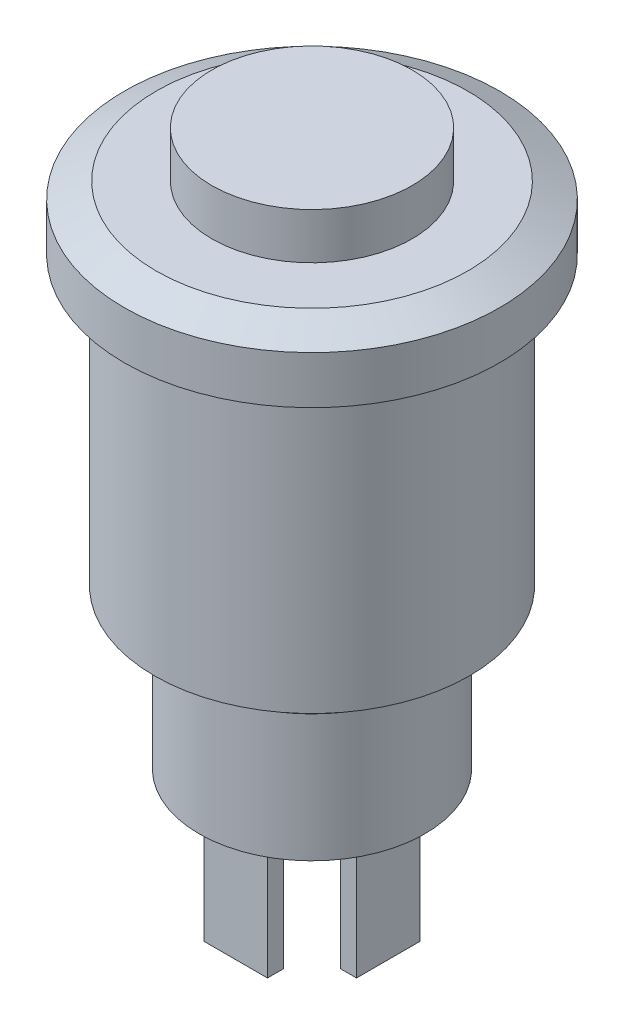
ISO-10303-21;
HEADER;
FILE_DESCRIPTION(('STEP AP214'),'2;1');
FILE_NAME('part.step','',(''),(''),'','','');
FILE_SCHEMA(('AUTOMOTIVE_DESIGN { 1 0 10303 214 1 1 1 1 }'));
ENDSEC;
DATA;
#1=APPLICATION_CONTEXT('core data for automotive mechanical design processes');
#2=APPLICATION_PROTOCOL_DEFINITION('international standard','automotive_design',2000,#1);
#3=PRODUCT_CONTEXT('',#1,'mechanical');
#4=PRODUCT('Part','Part','',(#3));
#5=PRODUCT_RELATED_PRODUCT_CATEGORY('part','',(#4));
#6=PRODUCT_DEFINITION_FORMATION('','',#4);
#7=PRODUCT_DEFINITION_CONTEXT('part definition',#1,'design');
#8=PRODUCT_DEFINITION('design','',#6,#7);
#9=PRODUCT_DEFINITION_SHAPE('','',#8);
#10=(LENGTH_UNIT() NAMED_UNIT(*) SI_UNIT(.MILLI.,.METRE.));
#11=(NAMED_UNIT(*) PLANE_ANGLE_UNIT() SI_UNIT($,.RADIAN.));
#12=(NAMED_UNIT(*) SI_UNIT($,.STERADIAN.) SOLID_ANGLE_UNIT());
#13=UNCERTAINTY_MEASURE_WITH_UNIT(LENGTH_MEASURE(1.E-05),#10,'distance_accuracy_value','');
#14=(GEOMETRIC_REPRESENTATION_CONTEXT(3) GLOBAL_UNCERTAINTY_ASSIGNED_CONTEXT((#13)) GLOBAL_UNIT_ASSIGNED_CONTEXT((#10,
#11,#12)) REPRESENTATION_CONTEXT('',''));
#15=CARTESIAN_POINT('',(0.,0.,0.));
#16=DIRECTION('',(0.,0.,1.));
#17=DIRECTION('',(1.,0.,0.));
#18=AXIS2_PLACEMENT_3D('',#15,#16,#17);
#19=CARTESIAN_POINT('',(-3.55,-14.,0.));
#20=DIRECTION('',(0.,-1.,0.));
#21=DIRECTION('',(0.,0.,-1.));
#22=AXIS2_PLACEMENT_3D('',#19,#20,#21);
#23=PLANE('',#22);
#24=CARTESIAN_POINT('',(0.,-14.,0.));
#25=DIRECTION('',(0.,1.,0.));
#26=DIRECTION('',(0.,0.,1.));
#27=AXIS2_PLACEMENT_3D('',#24,#25,#26);
#28=CIRCLE('',#27,3.55);
#29=CARTESIAN_POINT('',(0.,-14.,3.55));
#30=VERTEX_POINT('',#29);
#31=EDGE_CURVE('E269',#30,#30,#28,.T.);
#32=ORIENTED_EDGE('',*,*,#31,.F.);
#33=EDGE_LOOP('',(#32));
#34=FACE_BOUND('',#33,.T.);
#35=DIRECTION('',(1.,0.,0.));
#36=VECTOR('',#35,1.);
#37=CARTESIAN_POINT('',(-1.,-14.,1.9));
#38=LINE('',#37,#36);
#39=CARTESIAN_POINT('',(-1.,-14.,1.9));
#40=VERTEX_POINT('',#39);
#41=CARTESIAN_POINT('',(1.,-14.,1.9));
#42=VERTEX_POINT('',#41);
#43=EDGE_CURVE('E254',#40,#42,#38,.T.);
#44=ORIENTED_EDGE('',*,*,#43,.F.);
#45=DIRECTION('',(0.,0.,-1.));
#46=VECTOR('',#45,1.);
#47=CARTESIAN_POINT('',(-1.,-14.,2.4));
#48=LINE('',#47,#46);
#49=CARTESIAN_POINT('',(-1.,-14.,2.4));
#50=VERTEX_POINT('',#49);
#51=EDGE_CURVE('E240',#50,#40,#48,.T.);
#52=ORIENTED_EDGE('',*,*,#51,.F.);
#53=DIRECTION('',(-1.,0.,0.));
#54=VECTOR('',#53,1.);
#55=CARTESIAN_POINT('',(-1.,-14.,2.4));
#56=LINE('',#55,#54);
#57=CARTESIAN_POINT('',(1.,-14.,2.4));
#58=VERTEX_POINT('',#57);
#59=EDGE_CURVE('E245',#58,#50,#56,.T.);
#60=ORIENTED_EDGE('',*,*,#59,.F.);
#61=DIRECTION('',(0.,0.,1.));
#62=VECTOR('',#61,1.);
#63=CARTESIAN_POINT('',(1.,-14.,2.4));
#64=LINE('',#63,#62);
#65=EDGE_CURVE('E256',#42,#58,#64,.T.);
#66=ORIENTED_EDGE('',*,*,#65,.F.);
#67=EDGE_LOOP('',(#44,#52,#60,#66));
#68=FACE_BOUND('',#67,.T.);
#69=DIRECTION('',(0.,0.,1.));
#70=VECTOR('',#69,1.);
#71=CARTESIAN_POINT('',(-1.9,-14.,-1.00000000000001));
#72=LINE('',#71,#70);
#73=CARTESIAN_POINT('',(-1.9,-14.,-1.00000000000001));
#74=VERTEX_POINT('',#73);
#75=CARTESIAN_POINT('',(-1.9,-14.,0.999999999999993));
#76=VERTEX_POINT('',#75);
#77=EDGE_CURVE('E225',#74,#76,#72,.T.);
#78=ORIENTED_EDGE('',*,*,#77,.F.);
#79=DIRECTION('',(1.,0.,0.));
#80=VECTOR('',#79,1.);
#81=CARTESIAN_POINT('',(-2.4,-14.,-1.00000000000001));
#82=LINE('',#81,#80);
#83=CARTESIAN_POINT('',(-2.4,-14.,-1.00000000000001));
#84=VERTEX_POINT('',#83);
#85=EDGE_CURVE('E211',#84,#74,#82,.T.);
#86=ORIENTED_EDGE('',*,*,#85,.F.);
#87=DIRECTION('',(0.,0.,-1.));
#88=VECTOR('',#87,1.);
#89=CARTESIAN_POINT('',(-2.4,-14.,-1.00000000000001));
#90=LINE('',#89,#88);
#91=CARTESIAN_POINT('',(-2.4,-14.,0.999999999999992));
#92=VERTEX_POINT('',#91);
#93=EDGE_CURVE('E216',#92,#84,#90,.T.);
#94=ORIENTED_EDGE('',*,*,#93,.F.);
#95=DIRECTION('',(-1.,0.,0.));
#96=VECTOR('',#95,1.);
#97=CARTESIAN_POINT('',(-2.4,-14.,0.999999999999992));
#98=LINE('',#97,#96);
#99=EDGE_CURVE('E227',#76,#92,#98,.T.);
#100=ORIENTED_EDGE('',*,*,#99,.F.);
#101=EDGE_LOOP('',(#78,#86,#94,#100));
#102=FACE_BOUND('',#101,.T.);
#103=DIRECTION('',(-1.,0.,0.));
#104=VECTOR('',#103,1.);
#105=CARTESIAN_POINT('',(1.,-14.,-1.9));
#106=LINE('',#105,#104);
#107=CARTESIAN_POINT('',(1.,-14.,-1.9));
#108=VERTEX_POINT('',#107);
#109=CARTESIAN_POINT('',(-1.,-14.,-1.9));
#110=VERTEX_POINT('',#109);
#111=EDGE_CURVE('E183',#108,#110,#106,.T.);
#112=ORIENTED_EDGE('',*,*,#111,.F.);
#113=DIRECTION('',(0.,0.,1.));
#114=VECTOR('',#113,1.);
#115=CARTESIAN_POINT('',(1.,-14.,-2.4));
#116=LINE('',#115,#114);
#117=CARTESIAN_POINT('',(1.,-14.,-2.4));
#118=VERTEX_POINT('',#117);
#119=EDGE_CURVE('E180',#118,#108,#116,.T.);
#120=ORIENTED_EDGE('',*,*,#119,.F.);
#121=DIRECTION('',(1.,0.,0.));
#122=VECTOR('',#121,1.);
#123=CARTESIAN_POINT('',(1.,-14.,-2.4));
#124=LINE('',#123,#122);
#125=CARTESIAN_POINT('',(-1.,-14.,-2.4));
#126=VERTEX_POINT('',#125);
#127=EDGE_CURVE('E192',#126,#118,#124,.T.);
#128=ORIENTED_EDGE('',*,*,#127,.F.);
#129=DIRECTION('',(0.,0.,-1.));
#130=VECTOR('',#129,1.);
#131=CARTESIAN_POINT('',(-1.,-14.,-2.4));
#132=LINE('',#131,#130);
#133=EDGE_CURVE('E200',#110,#126,#132,.T.);
#134=ORIENTED_EDGE('',*,*,#133,.F.);
#135=EDGE_LOOP('',(#112,#120,#128,#134));
#136=FACE_BOUND('',#135,.T.);
#137=DIRECTION('',(0.,0.,-1.));
#138=VECTOR('',#137,1.);
#139=CARTESIAN_POINT('',(1.89999999999999,-14.,1.00000000000002));
#140=LINE('',#139,#138);
#141=CARTESIAN_POINT('',(1.89999999999999,-14.,1.00000000000002));
#142=VERTEX_POINT('',#141);
#143=CARTESIAN_POINT('',(1.90000000000001,-14.,-0.99999999999998));
#144=VERTEX_POINT('',#143);
#145=EDGE_CURVE('E671',#142,#144,#140,.T.);
#146=ORIENTED_EDGE('',*,*,#145,.F.);
#147=DIRECTION('',(-1.,0.,0.));
#148=VECTOR('',#147,1.);
#149=CARTESIAN_POINT('',(2.39999999999999,-14.,1.00000000000003));
#150=LINE('',#149,#148);
#151=CARTESIAN_POINT('',(2.39999999999999,-14.,1.00000000000003));
#152=VERTEX_POINT('',#151);
#153=EDGE_CURVE('E178',#152,#142,#150,.T.);
#154=ORIENTED_EDGE('',*,*,#153,.F.);
#155=DIRECTION('',(0.,0.,1.));
#156=VECTOR('',#155,1.);
#157=CARTESIAN_POINT('',(2.39999999999999,-14.,1.00000000000003));
#158=LINE('',#157,#156);
#159=CARTESIAN_POINT('',(2.40000000000001,-14.,-0.999999999999975));
#160=VERTEX_POINT('',#159);
#161=EDGE_CURVE('E174',#160,#152,#158,.T.);
#162=ORIENTED_EDGE('',*,*,#161,.F.);
#163=DIRECTION('',(1.,0.,0.));
#164=VECTOR('',#163,1.);
#165=CARTESIAN_POINT('',(2.40000000000001,-14.,-0.999999999999975));
#166=LINE('',#165,#164);
#167=EDGE_CURVE('E668',#144,#160,#166,.T.);
#168=ORIENTED_EDGE('',*,*,#167,.F.);
#169=EDGE_LOOP('',(#146,#154,#162,#168));
#170=FACE_BOUND('',#169,.T.);
#171=ADVANCED_FACE('F41',(#34,#68,#102,#136,#170),#23,.T.);
#172=CARTESIAN_POINT('',(0.,3.45,0.));
#173=DIRECTION('',(0.,1.,0.));
#174=DIRECTION('',(0.,0.,1.));
#175=AXIS2_PLACEMENT_3D('',#172,#173,#174);
#176=PLANE('',#175);
#177=CARTESIAN_POINT('',(0.,3.45,0.));
#178=DIRECTION('',(0.,1.,0.));
#179=DIRECTION('',(0.,0.,1.));
#180=AXIS2_PLACEMENT_3D('',#177,#178,#179);
#181=CIRCLE('',#180,3.14999999999999);
#182=CARTESIAN_POINT('',(0.,3.45,3.14999999999999));
#183=VERTEX_POINT('',#182);
#184=EDGE_CURVE('E11',#183,#183,#181,.T.);
#185=ORIENTED_EDGE('',*,*,#184,.T.);
#186=EDGE_LOOP('',(#185));
#187=FACE_BOUND('',#186,.T.);
#188=ADVANCED_FACE('F43',(#187),#176,.T.);
#189=CARTESIAN_POINT('',(0.,55.,0.));
#190=DIRECTION('',(0.,1.,0.));
#191=DIRECTION('',(0.,0.,1.));
#192=AXIS2_PLACEMENT_3D('',#189,#190,#191);
#193=CYLINDRICAL_SURFACE('',#192,3.14999999999999);
#194=CARTESIAN_POINT('',(0.,2.,0.));
#195=DIRECTION('',(0.,1.,0.));
#196=DIRECTION('',(0.,0.,1.));
#197=AXIS2_PLACEMENT_3D('',#194,#195,#196);
#198=CIRCLE('',#197,3.14999999999999);
#199=CARTESIAN_POINT('',(0.,2.,3.14999999999999));
#200=VERTEX_POINT('',#199);
#201=EDGE_CURVE('E49',#200,#200,#198,.T.);
#202=ORIENTED_EDGE('',*,*,#201,.T.);
#203=EDGE_LOOP('',(#202));
#204=FACE_BOUND('',#203,.T.);
#205=ORIENTED_EDGE('',*,*,#184,.F.);
#206=EDGE_LOOP('',(#205));
#207=FACE_BOUND('',#206,.T.);
#208=ADVANCED_FACE('F292',(#204,#207),#193,.T.);
#209=CARTESIAN_POINT('',(-3.14999999999999,2.,0.));
#210=DIRECTION('',(0.,1.,0.));
#211=DIRECTION('',(0.,0.,1.));
#212=AXIS2_PLACEMENT_3D('',#209,#210,#211);
#213=PLANE('',#212);
#214=CARTESIAN_POINT('',(0.,2.,0.));
#215=DIRECTION('',(0.,1.,0.));
#216=DIRECTION('',(0.,0.,1.));
#217=AXIS2_PLACEMENT_3D('',#214,#215,#216);
#218=CIRCLE('',#217,4.9);
#219=CARTESIAN_POINT('',(0.,2.,4.9));
#220=VERTEX_POINT('',#219);
#221=EDGE_CURVE('E287',#220,#220,#218,.T.);
#222=ORIENTED_EDGE('',*,*,#221,.T.);
#223=EDGE_LOOP('',(#222));
#224=FACE_BOUND('',#223,.T.);
#225=ORIENTED_EDGE('',*,*,#201,.F.);
#226=EDGE_LOOP('',(#225));
#227=FACE_BOUND('',#226,.T.);
#228=ADVANCED_FACE('F295',(#224,#227),#213,.T.);
#229=CARTESIAN_POINT('',(0.,2.,0.));
#230=DIRECTION('',(0.,-1.,0.));
#231=DIRECTION('',(0.,0.,-1.));
#232=AXIS2_PLACEMENT_3D('',#229,#230,#231);
#233=CONICAL_SURFACE('',#232,4.9,1.10714871779409);
#234=CARTESIAN_POINT('',(0.,1.5,0.));
#235=DIRECTION('',(0.,1.,0.));
#236=DIRECTION('',(0.,0.,1.));
#237=AXIS2_PLACEMENT_3D('',#234,#235,#236);
#238=CIRCLE('',#237,5.9);
#239=CARTESIAN_POINT('',(0.,1.5,5.9));
#240=VERTEX_POINT('',#239);
#241=EDGE_CURVE('E284',#240,#240,#238,.T.);
#242=ORIENTED_EDGE('',*,*,#241,.T.);
#243=EDGE_LOOP('',(#242));
#244=FACE_BOUND('',#243,.T.);
#245=ORIENTED_EDGE('',*,*,#221,.F.);
#246=EDGE_LOOP('',(#245));
#247=FACE_BOUND('',#246,.T.);
#248=ADVANCED_FACE('F297',(#244,#247),#233,.T.);
#249=CARTESIAN_POINT('',(0.,55.,0.));
#250=DIRECTION('',(0.,1.,0.));
#251=DIRECTION('',(0.,0.,1.));
#252=AXIS2_PLACEMENT_3D('',#249,#250,#251);
#253=CYLINDRICAL_SURFACE('',#252,5.9);
#254=CARTESIAN_POINT('',(0.,0.,0.));
#255=DIRECTION('',(0.,1.,0.));
#256=DIRECTION('',(0.,0.,1.));
#257=AXIS2_PLACEMENT_3D('',#254,#255,#256);
#258=CIRCLE('',#257,5.9);
#259=CARTESIAN_POINT('',(0.,0.,5.9));
#260=VERTEX_POINT('',#259);
#261=EDGE_CURVE('E281',#260,#260,#258,.T.);
#262=ORIENTED_EDGE('',*,*,#261,.T.);
#263=EDGE_LOOP('',(#262));
#264=FACE_BOUND('',#263,.T.);
#265=ORIENTED_EDGE('',*,*,#241,.F.);
#266=EDGE_LOOP('',(#265));
#267=FACE_BOUND('',#266,.T.);
#268=ADVANCED_FACE('F304',(#264,#267),#253,.T.);
#269=CARTESIAN_POINT('',(-5.9,0.,0.));
#270=DIRECTION('',(0.,-1.,0.));
#271=DIRECTION('',(0.,0.,-1.));
#272=AXIS2_PLACEMENT_3D('',#269,#270,#271);
#273=PLANE('',#272);
#274=CARTESIAN_POINT('',(0.,0.,0.));
#275=DIRECTION('',(0.,1.,0.));
#276=DIRECTION('',(0.,0.,1.));
#277=AXIS2_PLACEMENT_3D('',#274,#275,#276);
#278=CIRCLE('',#277,4.95);
#279=CARTESIAN_POINT('',(0.,0.,4.95));
#280=VERTEX_POINT('',#279);
#281=EDGE_CURVE('E278',#280,#280,#278,.T.);
#282=ORIENTED_EDGE('',*,*,#281,.T.);
#283=EDGE_LOOP('',(#282));
#284=FACE_BOUND('',#283,.T.);
#285=ORIENTED_EDGE('',*,*,#261,.F.);
#286=EDGE_LOOP('',(#285));
#287=FACE_BOUND('',#286,.T.);
#288=ADVANCED_FACE('F331',(#284,#287),#273,.T.);
#289=CARTESIAN_POINT('',(0.,55.,0.));
#290=DIRECTION('',(0.,1.,0.));
#291=DIRECTION('',(0.,0.,1.));
#292=AXIS2_PLACEMENT_3D('',#289,#290,#291);
#293=CYLINDRICAL_SURFACE('',#292,4.95);
#294=CARTESIAN_POINT('',(0.,-8.99999999999999,0.));
#295=DIRECTION('',(0.,1.,0.));
#296=DIRECTION('',(0.,0.,1.));
#297=AXIS2_PLACEMENT_3D('',#294,#295,#296);
#298=CIRCLE('',#297,4.94999999999999);
#299=CARTESIAN_POINT('',(0.,-8.99999999999999,4.94999999999999));
#300=VERTEX_POINT('',#299);
#301=EDGE_CURVE('E275',#300,#300,#298,.T.);
#302=ORIENTED_EDGE('',*,*,#301,.T.);
#303=EDGE_LOOP('',(#302));
#304=FACE_BOUND('',#303,.T.);
#305=ORIENTED_EDGE('',*,*,#281,.F.);
#306=EDGE_LOOP('',(#305));
#307=FACE_BOUND('',#306,.T.);
#308=ADVANCED_FACE('F327',(#304,#307),#293,.T.);
#309=CARTESIAN_POINT('',(0.,-8.99999999999999,0.));
#310=DIRECTION('',(0.,1.,0.));
#311=DIRECTION('',(0.,0.,1.));
#312=AXIS2_PLACEMENT_3D('',#309,#310,#311);
#313=CONICAL_SURFACE('',#312,4.94999999999999,0.950546840812074);
#314=CARTESIAN_POINT('',(0.,-9.99999999999999,0.));
#315=DIRECTION('',(0.,1.,0.));
#316=DIRECTION('',(0.,0.,1.));
#317=AXIS2_PLACEMENT_3D('',#314,#315,#316);
#318=CIRCLE('',#317,3.55);
#319=CARTESIAN_POINT('',(0.,-9.99999999999999,3.55));
#320=VERTEX_POINT('',#319);
#321=EDGE_CURVE('E272',#320,#320,#318,.T.);
#322=ORIENTED_EDGE('',*,*,#321,.T.);
#323=EDGE_LOOP('',(#322));
#324=FACE_BOUND('',#323,.T.);
#325=ORIENTED_EDGE('',*,*,#301,.F.);
#326=EDGE_LOOP('',(#325));
#327=FACE_BOUND('',#326,.T.);
#328=ADVANCED_FACE('F323',(#324,#327),#313,.T.);
#329=CARTESIAN_POINT('',(0.,55.,0.));
#330=DIRECTION('',(0.,1.,0.));
#331=DIRECTION('',(0.,0.,1.));
#332=AXIS2_PLACEMENT_3D('',#329,#330,#331);
#333=CYLINDRICAL_SURFACE('',#332,3.55);
#334=ORIENTED_EDGE('',*,*,#31,.T.);
#335=EDGE_LOOP('',(#334));
#336=FACE_BOUND('',#335,.T.);
#337=ORIENTED_EDGE('',*,*,#321,.F.);
#338=EDGE_LOOP('',(#337));
#339=FACE_BOUND('',#338,.T.);
#340=ADVANCED_FACE('F320',(#336,#339),#333,.T.);
#341=CARTESIAN_POINT('',(-1.,-18.,2.4));
#342=DIRECTION('',(1.,0.,0.));
#343=DIRECTION('',(0.,0.,-1.));
#344=AXIS2_PLACEMENT_3D('',#341,#342,#343);
#345=PLANE('',#344);
#346=ORIENTED_EDGE('',*,*,#51,.T.);
#347=DIRECTION('',(0.,1.,0.));
#348=VECTOR('',#347,1.);
#349=CARTESIAN_POINT('',(-1.,-18.,1.9));
#350=LINE('',#349,#348);
#351=CARTESIAN_POINT('',(-1.,-18.,1.9));
#352=VERTEX_POINT('',#351);
#353=EDGE_CURVE('E267',#352,#40,#350,.T.);
#354=ORIENTED_EDGE('',*,*,#353,.F.);
#355=DIRECTION('',(0.,0.,-1.));
#356=VECTOR('',#355,1.);
#357=CARTESIAN_POINT('',(-1.,-18.,2.4));
#358=LINE('',#357,#356);
#359=CARTESIAN_POINT('',(-1.,-18.,2.4));
#360=VERTEX_POINT('',#359);
#361=EDGE_CURVE('E241',#360,#352,#358,.T.);
#362=ORIENTED_EDGE('',*,*,#361,.F.);
#363=DIRECTION('',(0.,1.,0.));
#364=VECTOR('',#363,1.);
#365=CARTESIAN_POINT('',(-1.,-18.,2.4));
#366=LINE('',#365,#364);
#367=EDGE_CURVE('E251',#360,#50,#366,.T.);
#368=ORIENTED_EDGE('',*,*,#367,.T.);
#369=EDGE_LOOP('',(#346,#354,#362,#368));
#370=FACE_BOUND('',#369,.T.);
#371=ADVANCED_FACE('F318',(#370),#345,.F.);
#372=CARTESIAN_POINT('',(-1.,-18.,1.9));
#373=DIRECTION('',(0.,0.,1.));
#374=DIRECTION('',(1.,0.,0.));
#375=AXIS2_PLACEMENT_3D('',#372,#373,#374);
#376=PLANE('',#375);
#377=ORIENTED_EDGE('',*,*,#43,.T.);
#378=DIRECTION('',(0.,1.,0.));
#379=VECTOR('',#378,1.);
#380=CARTESIAN_POINT('',(1.,-18.,1.9));
#381=LINE('',#380,#379);
#382=CARTESIAN_POINT('',(1.,-18.,1.9));
#383=VERTEX_POINT('',#382);
#384=EDGE_CURVE('E264',#383,#42,#381,.T.);
#385=ORIENTED_EDGE('',*,*,#384,.F.);
#386=DIRECTION('',(1.,0.,0.));
#387=VECTOR('',#386,1.);
#388=CARTESIAN_POINT('',(-1.,-18.,1.9));
#389=LINE('',#388,#387);
#390=EDGE_CURVE('E244',#352,#383,#389,.T.);
#391=ORIENTED_EDGE('',*,*,#390,.F.);
#392=ORIENTED_EDGE('',*,*,#353,.T.);
#393=EDGE_LOOP('',(#377,#385,#391,#392));
#394=FACE_BOUND('',#393,.T.);
#395=ADVANCED_FACE('F370',(#394),#376,.F.);
#396=CARTESIAN_POINT('',(1.,-18.,2.4));
#397=DIRECTION('',(-1.,0.,0.));
#398=DIRECTION('',(0.,0.,1.));
#399=AXIS2_PLACEMENT_3D('',#396,#397,#398);
#400=PLANE('',#399);
#401=ORIENTED_EDGE('',*,*,#65,.T.);
#402=DIRECTION('',(0.,1.,0.));
#403=VECTOR('',#402,1.);
#404=CARTESIAN_POINT('',(1.,-18.,2.4));
#405=LINE('',#404,#403);
#406=CARTESIAN_POINT('',(1.,-18.,2.4));
#407=VERTEX_POINT('',#406);
#408=EDGE_CURVE('E262',#407,#58,#405,.T.);
#409=ORIENTED_EDGE('',*,*,#408,.F.);
#410=DIRECTION('',(0.,0.,1.));
#411=VECTOR('',#410,1.);
#412=CARTESIAN_POINT('',(1.,-18.,2.4));
#413=LINE('',#412,#411);
#414=EDGE_CURVE('E247',#383,#407,#413,.T.);
#415=ORIENTED_EDGE('',*,*,#414,.F.);
#416=ORIENTED_EDGE('',*,*,#384,.T.);
#417=EDGE_LOOP('',(#401,#409,#415,#416));
#418=FACE_BOUND('',#417,.T.);
#419=ADVANCED_FACE('F377',(#418),#400,.F.);
#420=CARTESIAN_POINT('',(-1.,-18.,2.4));
#421=DIRECTION('',(0.,0.,-1.));
#422=DIRECTION('',(-1.,0.,0.));
#423=AXIS2_PLACEMENT_3D('',#420,#421,#422);
#424=PLANE('',#423);
#425=ORIENTED_EDGE('',*,*,#59,.T.);
#426=ORIENTED_EDGE('',*,*,#367,.F.);
#427=DIRECTION('',(-1.,0.,0.));
#428=VECTOR('',#427,1.);
#429=CARTESIAN_POINT('',(-1.,-18.,2.4));
#430=LINE('',#429,#428);
#431=EDGE_CURVE('E249',#407,#360,#430,.T.);
#432=ORIENTED_EDGE('',*,*,#431,.F.);
#433=ORIENTED_EDGE('',*,*,#408,.T.);
#434=EDGE_LOOP('',(#425,#426,#432,#433));
#435=FACE_BOUND('',#434,.T.);
#436=ADVANCED_FACE('F384',(#435),#424,.F.);
#437=CARTESIAN_POINT('',(0.,-18.,0.));
#438=DIRECTION('',(0.,-1.,0.));
#439=DIRECTION('',(0.,0.,-1.));
#440=AXIS2_PLACEMENT_3D('',#437,#438,#439);
#441=PLANE('',#440);
#442=ORIENTED_EDGE('',*,*,#361,.T.);
#443=ORIENTED_EDGE('',*,*,#390,.T.);
#444=ORIENTED_EDGE('',*,*,#414,.T.);
#445=ORIENTED_EDGE('',*,*,#431,.T.);
#446=EDGE_LOOP('',(#442,#443,#444,#445));
#447=FACE_BOUND('',#446,.T.);
#448=ADVANCED_FACE('F392',(#447),#441,.T.);
#449=CARTESIAN_POINT('',(-2.4,-18.,-1.00000000000001));
#450=DIRECTION('',(0.,0.,1.));
#451=DIRECTION('',(1.,0.,0.));
#452=AXIS2_PLACEMENT_3D('',#449,#450,#451);
#453=PLANE('',#452);
#454=ORIENTED_EDGE('',*,*,#85,.T.);
#455=DIRECTION('',(0.,1.,0.));
#456=VECTOR('',#455,1.);
#457=CARTESIAN_POINT('',(-1.9,-18.,-1.00000000000001));
#458=LINE('',#457,#456);
#459=CARTESIAN_POINT('',(-1.9,-18.,-1.00000000000001));
#460=VERTEX_POINT('',#459);
#461=EDGE_CURVE('E238',#460,#74,#458,.T.);
#462=ORIENTED_EDGE('',*,*,#461,.F.);
#463=DIRECTION('',(1.,0.,0.));
#464=VECTOR('',#463,1.);
#465=CARTESIAN_POINT('',(-2.4,-18.,-1.00000000000001));
#466=LINE('',#465,#464);
#467=CARTESIAN_POINT('',(-2.4,-18.,-1.00000000000001));
#468=VERTEX_POINT('',#467);
#469=EDGE_CURVE('E212',#468,#460,#466,.T.);
#470=ORIENTED_EDGE('',*,*,#469,.F.);
#471=DIRECTION('',(0.,1.,0.));
#472=VECTOR('',#471,1.);
#473=CARTESIAN_POINT('',(-2.4,-18.,-1.00000000000001));
#474=LINE('',#473,#472);
#475=EDGE_CURVE('E222',#468,#84,#474,.T.);
#476=ORIENTED_EDGE('',*,*,#475,.T.);
#477=EDGE_LOOP('',(#454,#462,#470,#476));
#478=FACE_BOUND('',#477,.T.);
#479=ADVANCED_FACE('F400',(#478),#453,.F.);
#480=CARTESIAN_POINT('',(-1.9,-18.,-1.00000000000001));
#481=DIRECTION('',(-1.,0.,0.));
#482=DIRECTION('',(0.,0.,1.));
#483=AXIS2_PLACEMENT_3D('',#480,#481,#482);
#484=PLANE('',#483);
#485=ORIENTED_EDGE('',*,*,#77,.T.);
#486=DIRECTION('',(0.,1.,0.));
#487=VECTOR('',#486,1.);
#488=CARTESIAN_POINT('',(-1.9,-18.,0.999999999999993));
#489=LINE('',#488,#487);
#490=CARTESIAN_POINT('',(-1.9,-18.,0.999999999999993));
#491=VERTEX_POINT('',#490);
#492=EDGE_CURVE('E235',#491,#76,#489,.T.);
#493=ORIENTED_EDGE('',*,*,#492,.F.);
#494=DIRECTION('',(0.,0.,1.));
#495=VECTOR('',#494,1.);
#496=CARTESIAN_POINT('',(-1.9,-18.,-1.00000000000001));
#497=LINE('',#496,#495);
#498=EDGE_CURVE('E215',#460,#491,#497,.T.);
#499=ORIENTED_EDGE('',*,*,#498,.F.);
#500=ORIENTED_EDGE('',*,*,#461,.T.);
#501=EDGE_LOOP('',(#485,#493,#499,#500));
#502=FACE_BOUND('',#501,.T.);
#503=ADVANCED_FACE('F408',(#502),#484,.F.);
#504=CARTESIAN_POINT('',(-2.4,-18.,0.999999999999992));
#505=DIRECTION('',(0.,0.,-1.));
#506=DIRECTION('',(-1.,0.,0.));
#507=AXIS2_PLACEMENT_3D('',#504,#505,#506);
#508=PLANE('',#507);
#509=ORIENTED_EDGE('',*,*,#99,.T.);
#510=DIRECTION('',(0.,1.,0.));
#511=VECTOR('',#510,1.);
#512=CARTESIAN_POINT('',(-2.4,-18.,0.999999999999992));
#513=LINE('',#512,#511);
#514=CARTESIAN_POINT('',(-2.4,-18.,0.999999999999992));
#515=VERTEX_POINT('',#514);
#516=EDGE_CURVE('E233',#515,#92,#513,.T.);
#517=ORIENTED_EDGE('',*,*,#516,.F.);
#518=DIRECTION('',(-1.,0.,0.));
#519=VECTOR('',#518,1.);
#520=CARTESIAN_POINT('',(-2.4,-18.,0.999999999999992));
#521=LINE('',#520,#519);
#522=EDGE_CURVE('E218',#491,#515,#521,.T.);
#523=ORIENTED_EDGE('',*,*,#522,.F.);
#524=ORIENTED_EDGE('',*,*,#492,.T.);
#525=EDGE_LOOP('',(#509,#517,#523,#524));
#526=FACE_BOUND('',#525,.T.);
#527=ADVANCED_FACE('F416',(#526),#508,.F.);
#528=CARTESIAN_POINT('',(-2.4,-18.,-1.00000000000001));
#529=DIRECTION('',(1.,0.,0.));
#530=DIRECTION('',(0.,0.,-1.));
#531=AXIS2_PLACEMENT_3D('',#528,#529,#530);
#532=PLANE('',#531);
#533=ORIENTED_EDGE('',*,*,#93,.T.);
#534=ORIENTED_EDGE('',*,*,#475,.F.);
#535=DIRECTION('',(0.,0.,-1.));
#536=VECTOR('',#535,1.);
#537=CARTESIAN_POINT('',(-2.4,-18.,-1.00000000000001));
#538=LINE('',#537,#536);
#539=EDGE_CURVE('E220',#515,#468,#538,.T.);
#540=ORIENTED_EDGE('',*,*,#539,.F.);
#541=ORIENTED_EDGE('',*,*,#516,.T.);
#542=EDGE_LOOP('',(#533,#534,#540,#541));
#543=FACE_BOUND('',#542,.T.);
#544=ADVANCED_FACE('F424',(#543),#532,.F.);
#545=CARTESIAN_POINT('',(0.,-18.,0.));
#546=DIRECTION('',(0.,-1.,0.));
#547=DIRECTION('',(1.,0.,0.));
#548=AXIS2_PLACEMENT_3D('',#545,#546,#547);
#549=PLANE('',#548);
#550=ORIENTED_EDGE('',*,*,#469,.T.);
#551=ORIENTED_EDGE('',*,*,#498,.T.);
#552=ORIENTED_EDGE('',*,*,#522,.T.);
#553=ORIENTED_EDGE('',*,*,#539,.T.);
#554=EDGE_LOOP('',(#550,#551,#552,#553));
#555=FACE_BOUND('',#554,.T.);
#556=ADVANCED_FACE('F432',(#555),#549,.T.);
#557=CARTESIAN_POINT('',(1.,-18.,-2.4));
#558=DIRECTION('',(-1.,0.,0.));
#559=DIRECTION('',(0.,0.,1.));
#560=AXIS2_PLACEMENT_3D('',#557,#558,#559);
#561=PLANE('',#560);
#562=ORIENTED_EDGE('',*,*,#119,.T.);
#563=DIRECTION('',(0.,1.,0.));
#564=VECTOR('',#563,1.);
#565=CARTESIAN_POINT('',(1.,-18.,-1.9));
#566=LINE('',#565,#564);
#567=CARTESIAN_POINT('',(1.,-18.,-1.9));
#568=VERTEX_POINT('',#567);
#569=EDGE_CURVE('E209',#568,#108,#566,.T.);
#570=ORIENTED_EDGE('',*,*,#569,.F.);
#571=DIRECTION('',(0.,0.,1.));
#572=VECTOR('',#571,1.);
#573=CARTESIAN_POINT('',(1.,-18.,-2.4));
#574=LINE('',#573,#572);
#575=CARTESIAN_POINT('',(1.,-18.,-2.4));
#576=VERTEX_POINT('',#575);
#577=EDGE_CURVE('E188',#576,#568,#574,.T.);
#578=ORIENTED_EDGE('',*,*,#577,.F.);
#579=DIRECTION('',(0.,1.,0.));
#580=VECTOR('',#579,1.);
#581=CARTESIAN_POINT('',(1.,-18.,-2.4));
#582=LINE('',#581,#580);
#583=EDGE_CURVE('E197',#576,#118,#582,.T.);
#584=ORIENTED_EDGE('',*,*,#583,.T.);
#585=EDGE_LOOP('',(#562,#570,#578,#584));
#586=FACE_BOUND('',#585,.T.);
#587=ADVANCED_FACE('F440',(#586),#561,.F.);
#588=CARTESIAN_POINT('',(1.,-18.,-1.9));
#589=DIRECTION('',(0.,0.,-1.));
#590=DIRECTION('',(-1.,0.,0.));
#591=AXIS2_PLACEMENT_3D('',#588,#589,#590);
#592=PLANE('',#591);
#593=ORIENTED_EDGE('',*,*,#111,.T.);
#594=DIRECTION('',(0.,1.,0.));
#595=VECTOR('',#594,1.);
#596=CARTESIAN_POINT('',(-1.,-18.,-1.9));
#597=LINE('',#596,#595);
#598=CARTESIAN_POINT('',(-1.,-18.,-1.9));
#599=VERTEX_POINT('',#598);
#600=EDGE_CURVE('E206',#599,#110,#597,.T.);
#601=ORIENTED_EDGE('',*,*,#600,.F.);
#602=DIRECTION('',(-1.,0.,0.));
#603=VECTOR('',#602,1.);
#604=CARTESIAN_POINT('',(1.,-18.,-1.9));
#605=LINE('',#604,#603);
#606=EDGE_CURVE('E191',#568,#599,#605,.T.);
#607=ORIENTED_EDGE('',*,*,#606,.F.);
#608=ORIENTED_EDGE('',*,*,#569,.T.);
#609=EDGE_LOOP('',(#593,#601,#607,#608));
#610=FACE_BOUND('',#609,.T.);
#611=ADVANCED_FACE('F448',(#610),#592,.F.);
#612=CARTESIAN_POINT('',(-1.,-18.,-2.4));
#613=DIRECTION('',(1.,0.,0.));
#614=DIRECTION('',(0.,0.,-1.));
#615=AXIS2_PLACEMENT_3D('',#612,#613,#614);
#616=PLANE('',#615);
#617=ORIENTED_EDGE('',*,*,#133,.T.);
#618=DIRECTION('',(0.,1.,0.));
#619=VECTOR('',#618,1.);
#620=CARTESIAN_POINT('',(-1.,-18.,-2.4));
#621=LINE('',#620,#619);
#622=CARTESIAN_POINT('',(-1.,-18.,-2.4));
#623=VERTEX_POINT('',#622);
#624=EDGE_CURVE('E64',#623,#126,#621,.T.);
#625=ORIENTED_EDGE('',*,*,#624,.F.);
#626=DIRECTION('',(0.,0.,-1.));
#627=VECTOR('',#626,1.);
#628=CARTESIAN_POINT('',(-1.,-18.,-2.4));
#629=LINE('',#628,#627);
#630=EDGE_CURVE('E194',#599,#623,#629,.T.);
#631=ORIENTED_EDGE('',*,*,#630,.F.);
#632=ORIENTED_EDGE('',*,*,#600,.T.);
#633=EDGE_LOOP('',(#617,#625,#631,#632));
#634=FACE_BOUND('',#633,.T.);
#635=ADVANCED_FACE('F456',(#634),#616,.F.);
#636=CARTESIAN_POINT('',(1.,-18.,-2.4));
#637=DIRECTION('',(0.,0.,1.));
#638=DIRECTION('',(1.,0.,0.));
#639=AXIS2_PLACEMENT_3D('',#636,#637,#638);
#640=PLANE('',#639);
#641=ORIENTED_EDGE('',*,*,#127,.T.);
#642=ORIENTED_EDGE('',*,*,#583,.F.);
#643=DIRECTION('',(1.,0.,0.));
#644=VECTOR('',#643,1.);
#645=CARTESIAN_POINT('',(1.,-18.,-2.4));
#646=LINE('',#645,#644);
#647=EDGE_CURVE('E196',#623,#576,#646,.T.);
#648=ORIENTED_EDGE('',*,*,#647,.F.);
#649=ORIENTED_EDGE('',*,*,#624,.T.);
#650=EDGE_LOOP('',(#641,#642,#648,#649));
#651=FACE_BOUND('',#650,.T.);
#652=ADVANCED_FACE('F464',(#651),#640,.F.);
#653=CARTESIAN_POINT('',(0.,-18.,0.));
#654=DIRECTION('',(0.,-1.,0.));
#655=DIRECTION('',(0.,0.,1.));
#656=AXIS2_PLACEMENT_3D('',#653,#654,#655);
#657=PLANE('',#656);
#658=ORIENTED_EDGE('',*,*,#577,.T.);
#659=ORIENTED_EDGE('',*,*,#606,.T.);
#660=ORIENTED_EDGE('',*,*,#630,.T.);
#661=ORIENTED_EDGE('',*,*,#647,.T.);
#662=EDGE_LOOP('',(#658,#659,#660,#661));
#663=FACE_BOUND('',#662,.T.);
#664=ADVANCED_FACE('F472',(#663),#657,.T.);
#665=CARTESIAN_POINT('',(2.39999999999999,-18.,1.00000000000003));
#666=DIRECTION('',(0.,0.,-1.));
#667=DIRECTION('',(-1.,0.,0.));
#668=AXIS2_PLACEMENT_3D('',#665,#666,#667);
#669=PLANE('',#668);
#670=ORIENTED_EDGE('',*,*,#153,.T.);
#671=DIRECTION('',(0.,1.,0.));
#672=VECTOR('',#671,1.);
#673=CARTESIAN_POINT('',(1.89999999999999,-18.,1.00000000000002));
#674=LINE('',#673,#672);
#675=CARTESIAN_POINT('',(1.89999999999999,-18.,1.00000000000002));
#676=VERTEX_POINT('',#675);
#677=EDGE_CURVE('E159',#676,#142,#674,.T.);
#678=ORIENTED_EDGE('',*,*,#677,.F.);
#679=DIRECTION('',(-1.,0.,0.));
#680=VECTOR('',#679,1.);
#681=CARTESIAN_POINT('',(2.39999999999999,-18.,1.00000000000003));
#682=LINE('',#681,#680);
#683=CARTESIAN_POINT('',(2.39999999999999,-18.,1.00000000000003));
#684=VERTEX_POINT('',#683);
#685=EDGE_CURVE('E166',#684,#676,#682,.T.);
#686=ORIENTED_EDGE('',*,*,#685,.F.);
#687=DIRECTION('',(0.,1.,0.));
#688=VECTOR('',#687,1.);
#689=CARTESIAN_POINT('',(2.39999999999999,-18.,1.00000000000003));
#690=LINE('',#689,#688);
#691=EDGE_CURVE('E665',#684,#152,#690,.T.);
#692=ORIENTED_EDGE('',*,*,#691,.T.);
#693=EDGE_LOOP('',(#670,#678,#686,#692));
#694=FACE_BOUND('',#693,.T.);
#695=ADVANCED_FACE('F176',(#694),#669,.F.);
#696=CARTESIAN_POINT('',(1.89999999999999,-18.,1.00000000000002));
#697=DIRECTION('',(1.,0.,0.));
#698=DIRECTION('',(0.,0.,-1.));
#699=AXIS2_PLACEMENT_3D('',#696,#697,#698);
#700=PLANE('',#699);
#701=ORIENTED_EDGE('',*,*,#145,.T.);
#702=DIRECTION('',(0.,1.,0.));
#703=VECTOR('',#702,1.);
#704=CARTESIAN_POINT('',(1.90000000000001,-18.,-0.99999999999998));
#705=LINE('',#704,#703);
#706=CARTESIAN_POINT('',(1.90000000000001,-18.,-0.99999999999998));
#707=VERTEX_POINT('',#706);
#708=EDGE_CURVE('E162',#707,#144,#705,.T.);
#709=ORIENTED_EDGE('',*,*,#708,.F.);
#710=DIRECTION('',(0.,0.,-1.));
#711=VECTOR('',#710,1.);
#712=CARTESIAN_POINT('',(1.89999999999999,-18.,1.00000000000002));
#713=LINE('',#712,#711);
#714=EDGE_CURVE('E155',#676,#707,#713,.T.);
#715=ORIENTED_EDGE('',*,*,#714,.F.);
#716=ORIENTED_EDGE('',*,*,#677,.T.);
#717=EDGE_LOOP('',(#701,#709,#715,#716));
#718=FACE_BOUND('',#717,.T.);
#719=ADVANCED_FACE('F157',(#718),#700,.F.);
#720=CARTESIAN_POINT('',(2.40000000000001,-18.,-0.999999999999975));
#721=DIRECTION('',(0.,0.,1.));
#722=DIRECTION('',(1.,0.,0.));
#723=AXIS2_PLACEMENT_3D('',#720,#721,#722);
#724=PLANE('',#723);
#725=ORIENTED_EDGE('',*,*,#167,.T.);
#726=DIRECTION('',(0.,1.,0.));
#727=VECTOR('',#726,1.);
#728=CARTESIAN_POINT('',(2.40000000000001,-18.,-0.999999999999975));
#729=LINE('',#728,#727);
#730=CARTESIAN_POINT('',(2.40000000000001,-18.,-0.999999999999975));
#731=VERTEX_POINT('',#730);
#732=EDGE_CURVE('E56',#731,#160,#729,.T.);
#733=ORIENTED_EDGE('',*,*,#732,.F.);
#734=DIRECTION('',(1.,0.,0.));
#735=VECTOR('',#734,1.);
#736=CARTESIAN_POINT('',(2.40000000000001,-18.,-0.999999999999975));
#737=LINE('',#736,#735);
#738=EDGE_CURVE('E165',#707,#731,#737,.T.);
#739=ORIENTED_EDGE('',*,*,#738,.F.);
#740=ORIENTED_EDGE('',*,*,#708,.T.);
#741=EDGE_LOOP('',(#725,#733,#739,#740));
#742=FACE_BOUND('',#741,.T.);
#743=ADVANCED_FACE('F492',(#742),#724,.F.);
#744=CARTESIAN_POINT('',(2.39999999999999,-18.,1.00000000000003));
#745=DIRECTION('',(-1.,0.,0.));
#746=DIRECTION('',(0.,0.,1.));
#747=AXIS2_PLACEMENT_3D('',#744,#745,#746);
#748=PLANE('',#747);
#749=ORIENTED_EDGE('',*,*,#161,.T.);
#750=ORIENTED_EDGE('',*,*,#691,.F.);
#751=DIRECTION('',(0.,0.,1.));
#752=VECTOR('',#751,1.);
#753=CARTESIAN_POINT('',(2.39999999999999,-18.,1.00000000000003));
#754=LINE('',#753,#752);
#755=EDGE_CURVE('E170',#731,#684,#754,.T.);
#756=ORIENTED_EDGE('',*,*,#755,.F.);
#757=ORIENTED_EDGE('',*,*,#732,.T.);
#758=EDGE_LOOP('',(#749,#750,#756,#757));
#759=FACE_BOUND('',#758,.T.);
#760=ADVANCED_FACE('F499',(#759),#748,.F.);
#761=CARTESIAN_POINT('',(0.,-18.,0.));
#762=DIRECTION('',(0.,-1.,0.));
#763=DIRECTION('',(-1.,0.,0.));
#764=AXIS2_PLACEMENT_3D('',#761,#762,#763);
#765=PLANE('',#764);
#766=ORIENTED_EDGE('',*,*,#685,.T.);
#767=ORIENTED_EDGE('',*,*,#714,.T.);
#768=ORIENTED_EDGE('',*,*,#738,.T.);
#769=ORIENTED_EDGE('',*,*,#755,.T.);
#770=EDGE_LOOP('',(#766,#767,#768,#769));
#771=FACE_BOUND('',#770,.T.);
#772=ADVANCED_FACE('F169',(#771),#765,.T.);
#773=CLOSED_SHELL('',(#171,#188,#208,#228,#248,#268,#288,#308,#328,#340,#371,#395,#419,#436,
#448,#479,#503,#527,#544,#556,#587,#611,#635,#652,#664,#695,#719,#743,#760,#772));
#774=MANIFOLD_SOLID_BREP('B2',#773);
#775=ADVANCED_BREP_SHAPE_REPRESENTATION('',(#18,#774),#14);
#776=SHAPE_DEFINITION_REPRESENTATION(#9,#775);
ENDSEC;
END-ISO-10303-21;
